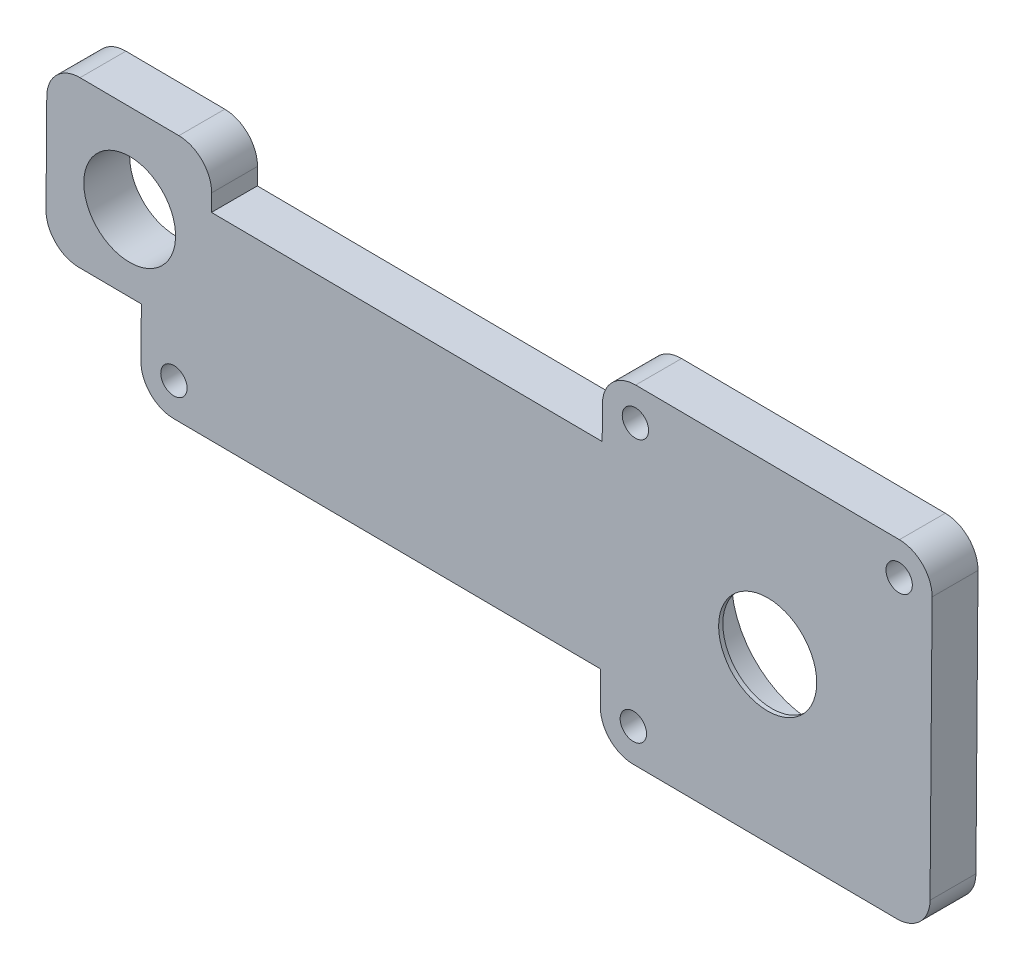
ISO-10303-21;
HEADER;
FILE_DESCRIPTION(('STEP AP214'),'2;1');
FILE_NAME('part.step','',(''),(''),'','','');
FILE_SCHEMA(('AUTOMOTIVE_DESIGN { 1 0 10303 214 1 1 1 1 }'));
ENDSEC;
DATA;
#1=APPLICATION_CONTEXT('core data for automotive mechanical design processes');
#2=APPLICATION_PROTOCOL_DEFINITION('international standard','automotive_design',2000,#1);
#3=PRODUCT_CONTEXT('',#1,'mechanical');
#4=PRODUCT('Part','Part','',(#3));
#5=PRODUCT_RELATED_PRODUCT_CATEGORY('part','',(#4));
#6=PRODUCT_DEFINITION_FORMATION('','',#4);
#7=PRODUCT_DEFINITION_CONTEXT('part definition',#1,'design');
#8=PRODUCT_DEFINITION('design','',#6,#7);
#9=PRODUCT_DEFINITION_SHAPE('','',#8);
#10=(LENGTH_UNIT() NAMED_UNIT(*) SI_UNIT(.MILLI.,.METRE.));
#11=(NAMED_UNIT(*) PLANE_ANGLE_UNIT() SI_UNIT($,.RADIAN.));
#12=(NAMED_UNIT(*) SI_UNIT($,.STERADIAN.) SOLID_ANGLE_UNIT());
#13=UNCERTAINTY_MEASURE_WITH_UNIT(LENGTH_MEASURE(1.E-05),#10,'distance_accuracy_value','');
#14=(GEOMETRIC_REPRESENTATION_CONTEXT(3) GLOBAL_UNCERTAINTY_ASSIGNED_CONTEXT((#13)) GLOBAL_UNIT_ASSIGNED_CONTEXT((#10,
#11,#12)) REPRESENTATION_CONTEXT('',''));
#15=CARTESIAN_POINT('',(0.,0.,0.));
#16=DIRECTION('',(0.,0.,1.));
#17=DIRECTION('',(1.,0.,0.));
#18=AXIS2_PLACEMENT_3D('',#15,#16,#17);
#19=CARTESIAN_POINT('',(33.387081626011,0.456569755791503,4.4196));
#20=DIRECTION('',(0.,0.,-1.));
#21=DIRECTION('',(-1.,0.,0.));
#22=AXIS2_PLACEMENT_3D('',#19,#20,#21);
#23=CYLINDRICAL_SURFACE('',#22,4.7244);
#24=CARTESIAN_POINT('',(33.387081626011,0.456569755791503,4.4196));
#25=DIRECTION('',(0.,0.,1.));
#26=DIRECTION('',(1.,0.,0.));
#27=AXIS2_PLACEMENT_3D('',#24,#25,#26);
#28=CIRCLE('',#27,4.7244);
#29=CARTESIAN_POINT('',(38.111481626011,0.456569755791503,4.4196));
#30=VERTEX_POINT('',#29);
#31=EDGE_CURVE('E210',#30,#30,#28,.T.);
#32=ORIENTED_EDGE('',*,*,#31,.T.);
#33=EDGE_LOOP('',(#32));
#34=FACE_BOUND('',#33,.T.);
#35=CARTESIAN_POINT('',(33.387081626011,0.456569755791503,4.0132));
#36=DIRECTION('',(0.,0.,-1.));
#37=DIRECTION('',(-1.,0.,0.));
#38=AXIS2_PLACEMENT_3D('',#35,#36,#37);
#39=CIRCLE('',#38,4.7244);
#40=CARTESIAN_POINT('',(28.662681626011,0.456569755791503,4.0132));
#41=VERTEX_POINT('',#40);
#42=EDGE_CURVE('E39',#41,#41,#39,.T.);
#43=ORIENTED_EDGE('',*,*,#42,.T.);
#44=EDGE_LOOP('',(#43));
#45=FACE_BOUND('',#44,.T.);
#46=ADVANCED_FACE('F35',(#34,#45),#23,.F.);
#47=CARTESIAN_POINT('',(20.4512958171625,-12.0057845236984,4.4196));
#48=DIRECTION('',(0.,0.,1.));
#49=DIRECTION('',(1.,0.,0.));
#50=AXIS2_PLACEMENT_3D('',#47,#48,#49);
#51=PLANE('',#50);
#52=CARTESIAN_POINT('',(-23.7950447085191,-5.30793293938964,4.4196));
#53=DIRECTION('',(0.,0.,-1.));
#54=DIRECTION('',(-1.,0.,0.));
#55=AXIS2_PLACEMENT_3D('',#52,#53,#54);
#56=CIRCLE('',#55,1.27);
#57=CARTESIAN_POINT('',(-25.0650447085191,-5.30793293938964,4.4196));
#58=VERTEX_POINT('',#57);
#59=EDGE_CURVE('E488',#58,#58,#56,.T.);
#60=ORIENTED_EDGE('',*,*,#59,.T.);
#61=EDGE_LOOP('',(#60));
#62=FACE_BOUND('',#61,.T.);
#63=CARTESIAN_POINT('',(20.4512958171625,-12.0057845236984,4.4196));
#64=DIRECTION('',(0.,0.,-1.));
#65=DIRECTION('',(-1.,0.,0.));
#66=AXIS2_PLACEMENT_3D('',#63,#64,#65);
#67=CIRCLE('',#66,1.27);
#68=CARTESIAN_POINT('',(19.1812958171625,-12.0057845236984,4.4196));
#69=VERTEX_POINT('',#68);
#70=EDGE_CURVE('E492',#69,#69,#67,.T.);
#71=ORIENTED_EDGE('',*,*,#70,.T.);
#72=EDGE_LOOP('',(#71));
#73=FACE_BOUND('',#72,.T.);
#74=CARTESIAN_POINT('',(20.6508643890522,13.3934314560344,4.4196));
#75=DIRECTION('',(0.,0.,-1.));
#76=DIRECTION('',(-1.,0.,0.));
#77=AXIS2_PLACEMENT_3D('',#74,#75,#76);
#78=CIRCLE('',#77,1.27);
#79=CARTESIAN_POINT('',(19.3808643890522,13.3934314560344,4.4196));
#80=VERTEX_POINT('',#79);
#81=EDGE_CURVE('E496',#80,#80,#78,.T.);
#82=ORIENTED_EDGE('',*,*,#81,.T.);
#83=EDGE_LOOP('',(#82));
#84=FACE_BOUND('',#83,.T.);
#85=CARTESIAN_POINT('',(46.0500803687849,13.1938628841448,4.4196));
#86=DIRECTION('',(0.,0.,-1.));
#87=DIRECTION('',(-1.,0.,0.));
#88=AXIS2_PLACEMENT_3D('',#85,#86,#87);
#89=CIRCLE('',#88,1.27);
#90=CARTESIAN_POINT('',(44.7800803687849,13.1938628841448,4.4196));
#91=VERTEX_POINT('',#90);
#92=EDGE_CURVE('E500',#91,#91,#89,.T.);
#93=ORIENTED_EDGE('',*,*,#92,.T.);
#94=EDGE_LOOP('',(#93));
#95=FACE_BOUND('',#94,.T.);
#96=CARTESIAN_POINT('',(-28.0559815167822,6.85189940269737,4.4196));
#97=DIRECTION('',(0.,0.,-1.));
#98=DIRECTION('',(-1.,0.,0.));
#99=AXIS2_PLACEMENT_3D('',#96,#97,#98);
#100=CIRCLE('',#99,4.4196);
#101=CARTESIAN_POINT('',(-32.4755815167822,6.85189940269737,4.4196));
#102=VERTEX_POINT('',#101);
#103=EDGE_CURVE('E504',#102,#102,#100,.T.);
#104=ORIENTED_EDGE('',*,*,#103,.T.);
#105=EDGE_LOOP('',(#104));
#106=FACE_BOUND('',#105,.T.);
#107=DIRECTION('',(0.999969133060346,-0.00785703038935576,0.));
#108=VECTOR('',#107,1.);
#109=CARTESIAN_POINT('',(-23.8199907800052,-8.48283493685624,4.4196));
#110=LINE('',#109,#108);
#111=CARTESIAN_POINT('',(-23.8199907800052,-8.48283493685624,4.4196));
#112=VERTEX_POINT('',#111);
#113=CARTESIAN_POINT('',(17.3013398911821,-8.80593645474556,4.4196));
#114=VERTEX_POINT('',#113);
#115=EDGE_CURVE('E245',#112,#114,#110,.T.);
#116=ORIENTED_EDGE('',*,*,#115,.T.);
#117=DIRECTION('',(-0.00785703038935553,-0.999969133060346,0.));
#118=VECTOR('',#117,1.);
#119=CARTESIAN_POINT('',(17.3013398911821,-8.80593645474556,4.4196));
#120=LINE('',#119,#118);
#121=CARTESIAN_POINT('',(17.2763938196959,-11.9808384522122,4.4196));
#122=VERTEX_POINT('',#121);
#123=EDGE_CURVE('E132',#114,#122,#120,.T.);
#124=ORIENTED_EDGE('',*,*,#123,.T.);
#125=CARTESIAN_POINT('',(20.4512958171625,-12.0057845236984,4.4196));
#126=DIRECTION('',(0.,0.,1.));
#127=DIRECTION('',(1.,0.,0.));
#128=AXIS2_PLACEMENT_3D('',#125,#126,#127);
#129=CIRCLE('',#128,3.175);
#130=CARTESIAN_POINT('',(20.4263497456763,-15.180686521165,4.4196));
#131=VERTEX_POINT('',#130);
#132=EDGE_CURVE('E297',#122,#131,#129,.T.);
#133=ORIENTED_EDGE('',*,*,#132,.T.);
#134=DIRECTION('',(0.999969133060346,-0.00785703038935567,0.));
#135=VECTOR('',#134,1.);
#136=CARTESIAN_POINT('',(20.4263497456763,-15.180686521165,4.4196));
#137=LINE('',#136,#135);
#138=CARTESIAN_POINT('',(45.8255657254091,-15.3802550930546,4.4196));
#139=VERTEX_POINT('',#138);
#140=EDGE_CURVE('E315',#131,#139,#137,.T.);
#141=ORIENTED_EDGE('',*,*,#140,.T.);
#142=CARTESIAN_POINT('',(45.8505117968953,-12.205353095588,4.4196));
#143=DIRECTION('',(0.,0.,1.));
#144=DIRECTION('',(1.,0.,0.));
#145=AXIS2_PLACEMENT_3D('',#142,#143,#144);
#146=CIRCLE('',#145,3.175);
#147=CARTESIAN_POINT('',(49.0254137943619,-12.2302991670742,4.4196));
#148=VERTEX_POINT('',#147);
#149=EDGE_CURVE('E312',#139,#148,#146,.T.);
#150=ORIENTED_EDGE('',*,*,#149,.T.);
#151=DIRECTION('',(0.00785703038935553,0.999969133060346,0.));
#152=VECTOR('',#151,1.);
#153=CARTESIAN_POINT('',(49.0254137943619,-12.2302991670742,4.4196));
#154=LINE('',#153,#152);
#155=CARTESIAN_POINT('',(49.2249823662515,13.1689168126586,4.4196));
#156=VERTEX_POINT('',#155);
#157=EDGE_CURVE('E314',#148,#156,#154,.T.);
#158=ORIENTED_EDGE('',*,*,#157,.T.);
#159=CARTESIAN_POINT('',(46.0500803687849,13.1938628841448,4.4196));
#160=DIRECTION('',(0.,0.,1.));
#161=DIRECTION('',(1.,0.,0.));
#162=AXIS2_PLACEMENT_3D('',#159,#160,#161);
#163=CIRCLE('',#162,3.17499999999999);
#164=CARTESIAN_POINT('',(46.0750264402711,16.3687648816114,4.4196));
#165=VERTEX_POINT('',#164);
#166=EDGE_CURVE('E317',#156,#165,#163,.T.);
#167=ORIENTED_EDGE('',*,*,#166,.T.);
#168=DIRECTION('',(-0.999969133060346,0.00785703038935594,0.));
#169=VECTOR('',#168,1.);
#170=CARTESIAN_POINT('',(46.0750264402711,16.3687648816114,4.4196));
#171=LINE('',#170,#169);
#172=CARTESIAN_POINT('',(20.6758104605384,16.568333453501,4.4196));
#173=VERTEX_POINT('',#172);
#174=EDGE_CURVE('E323',#165,#173,#171,.T.);
#175=ORIENTED_EDGE('',*,*,#174,.T.);
#176=CARTESIAN_POINT('',(20.6508643890522,13.3934314560344,4.4196));
#177=DIRECTION('',(0.,0.,1.));
#178=DIRECTION('',(1.,0.,0.));
#179=AXIS2_PLACEMENT_3D('',#176,#177,#178);
#180=CIRCLE('',#179,3.175);
#181=CARTESIAN_POINT('',(17.4759623915856,13.4183775275206,4.4196));
#182=VERTEX_POINT('',#181);
#183=EDGE_CURVE('E325',#173,#182,#180,.T.);
#184=ORIENTED_EDGE('',*,*,#183,.T.);
#185=DIRECTION('',(-0.0078570303893556,-0.999969133060347,0.));
#186=VECTOR('',#185,1.);
#187=CARTESIAN_POINT('',(17.4759623915856,13.4183775275206,4.4196));
#188=LINE('',#187,#186);
#189=CARTESIAN_POINT('',(17.4510163200994,10.243475530054,4.4196));
#190=VERTEX_POINT('',#189);
#191=EDGE_CURVE('E327',#182,#190,#188,.T.);
#192=ORIENTED_EDGE('',*,*,#191,.T.);
#193=DIRECTION('',(-0.999969133060346,0.00785703038935576,0.));
#194=VECTOR('',#193,1.);
#195=CARTESIAN_POINT('',(17.4510163200994,10.243475530054,4.4196));
#196=LINE('',#195,#194);
#197=CARTESIAN_POINT('',(-20.1783852823722,10.5391400082355,4.4196));
#198=VERTEX_POINT('',#197);
#199=EDGE_CURVE('E329',#190,#198,#196,.T.);
#200=ORIENTED_EDGE('',*,*,#199,.T.);
#201=DIRECTION('',(0.00785703038935568,0.999969133060346,0.));
#202=VECTOR('',#201,1.);
#203=CARTESIAN_POINT('',(-20.1783852823722,10.5391400082355,4.4196));
#204=LINE('',#203,#202);
#205=CARTESIAN_POINT('',(-20.1655560902158,12.1719192546872,4.4196));
#206=VERTEX_POINT('',#205);
#207=EDGE_CURVE('E331',#198,#206,#204,.T.);
#208=ORIENTED_EDGE('',*,*,#207,.T.);
#209=CARTESIAN_POINT('',(-23.3404580876824,12.1968653261734,4.4196));
#210=DIRECTION('',(0.,0.,1.));
#211=DIRECTION('',(1.,0.,0.));
#212=AXIS2_PLACEMENT_3D('',#209,#210,#211);
#213=CIRCLE('',#212,3.175);
#214=CARTESIAN_POINT('',(-23.3155120161963,15.37176732364,4.4196));
#215=VERTEX_POINT('',#214);
#216=EDGE_CURVE('E333',#206,#215,#213,.T.);
#217=ORIENTED_EDGE('',*,*,#216,.T.);
#218=DIRECTION('',(-0.999969133060346,0.00785703038935519,0.));
#219=VECTOR('',#218,1.);
#220=CARTESIAN_POINT('',(-23.3155120161963,15.37176732364,4.4196));
#221=LINE('',#220,#219);
#222=CARTESIAN_POINT('',(-32.840218008596,15.4466055380986,4.4196));
#223=VERTEX_POINT('',#222);
#224=EDGE_CURVE('E335',#215,#223,#221,.T.);
#225=ORIENTED_EDGE('',*,*,#224,.T.);
#226=CARTESIAN_POINT('',(-32.8651640800823,12.271703540632,4.4196));
#227=DIRECTION('',(0.,0.,1.));
#228=DIRECTION('',(1.,0.,0.));
#229=AXIS2_PLACEMENT_3D('',#226,#227,#228);
#230=CIRCLE('',#229,3.175);
#231=CARTESIAN_POINT('',(-36.0400660775488,12.2966496121182,4.4196));
#232=VERTEX_POINT('',#231);
#233=EDGE_CURVE('E337',#223,#232,#230,.T.);
#234=ORIENTED_EDGE('',*,*,#233,.T.);
#235=DIRECTION('',(-0.00785703038935555,-0.999969133060346,0.));
#236=VECTOR('',#235,1.);
#237=CARTESIAN_POINT('',(-36.0400660775488,12.2966496121182,4.4196));
#238=LINE('',#237,#236);
#239=CARTESIAN_POINT('',(-36.1149042920075,2.77194361971845,4.4196));
#240=VERTEX_POINT('',#239);
#241=EDGE_CURVE('E339',#232,#240,#238,.T.);
#242=ORIENTED_EDGE('',*,*,#241,.T.);
#243=CARTESIAN_POINT('',(-32.9400022945409,2.74699754823223,4.4196));
#244=DIRECTION('',(0.,0.,1.));
#245=DIRECTION('',(1.,0.,0.));
#246=AXIS2_PLACEMENT_3D('',#243,#244,#245);
#247=CIRCLE('',#246,3.175);
#248=CARTESIAN_POINT('',(-32.964948366027,-0.427904449234371,4.4196));
#249=VERTEX_POINT('',#248);
#250=EDGE_CURVE('E188',#240,#249,#247,.T.);
#251=ORIENTED_EDGE('',*,*,#250,.T.);
#252=DIRECTION('',(0.999969133060346,-0.00785703038935611,0.));
#253=VECTOR('',#252,1.);
#254=CARTESIAN_POINT('',(-32.964948366027,-0.427904449234371,4.4196));
#255=LINE('',#254,#253);
#256=CARTESIAN_POINT('',(-26.9321714423431,-0.475305623985163,4.4196));
#257=VERTEX_POINT('',#256);
#258=EDGE_CURVE('E181',#249,#257,#255,.T.);
#259=ORIENTED_EDGE('',*,*,#258,.T.);
#260=DIRECTION('',(-0.00785703038935558,-0.999969133060346,0.));
#261=VECTOR('',#260,1.);
#262=CARTESIAN_POINT('',(-26.9321714423431,-0.475305623985163,4.4196));
#263=LINE('',#262,#261);
#264=CARTESIAN_POINT('',(-26.9699467059857,-5.28298686790341,4.4196));
#265=VERTEX_POINT('',#264);
#266=EDGE_CURVE('E186',#257,#265,#263,.T.);
#267=ORIENTED_EDGE('',*,*,#266,.T.);
#268=CARTESIAN_POINT('',(-23.7950447085191,-5.30793293938964,4.4196));
#269=DIRECTION('',(0.,0.,1.));
#270=DIRECTION('',(1.,0.,0.));
#271=AXIS2_PLACEMENT_3D('',#268,#269,#270);
#272=CIRCLE('',#271,3.175);
#273=EDGE_CURVE('E53',#265,#112,#272,.T.);
#274=ORIENTED_EDGE('',*,*,#273,.T.);
#275=EDGE_LOOP('',(#116,#124,#133,#141,#150,#158,#167,#175,#184,#192,#200,#208,#217,#225,#234,
#242,#251,#259,#267,#274));
#276=FACE_BOUND('',#275,.T.);
#277=ORIENTED_EDGE('',*,*,#31,.F.);
#278=EDGE_LOOP('',(#277));
#279=FACE_BOUND('',#278,.T.);
#280=ADVANCED_FACE('F183',(#62,#73,#84,#95,#106,#276,#279),#51,.T.);
#281=CARTESIAN_POINT('',(20.4512958171625,-12.0057845236984,0.));
#282=DIRECTION('',(0.,0.,1.));
#283=DIRECTION('',(1.,0.,0.));
#284=AXIS2_PLACEMENT_3D('',#281,#282,#283);
#285=PLANE('',#284);
#286=CARTESIAN_POINT('',(-23.7950447085191,-5.30793293938964,0.));
#287=DIRECTION('',(0.,0.,-1.));
#288=DIRECTION('',(-1.,0.,0.));
#289=AXIS2_PLACEMENT_3D('',#286,#287,#288);
#290=CIRCLE('',#289,1.27);
#291=CARTESIAN_POINT('',(-25.0650447085191,-5.30793293938964,0.));
#292=VERTEX_POINT('',#291);
#293=EDGE_CURVE('E386',#292,#292,#290,.T.);
#294=ORIENTED_EDGE('',*,*,#293,.F.);
#295=EDGE_LOOP('',(#294));
#296=FACE_BOUND('',#295,.T.);
#297=CARTESIAN_POINT('',(20.4512958171625,-12.0057845236984,0.));
#298=DIRECTION('',(0.,0.,-1.));
#299=DIRECTION('',(-1.,0.,0.));
#300=AXIS2_PLACEMENT_3D('',#297,#298,#299);
#301=CIRCLE('',#300,1.27);
#302=CARTESIAN_POINT('',(19.1812958171625,-12.0057845236984,0.));
#303=VERTEX_POINT('',#302);
#304=EDGE_CURVE('E390',#303,#303,#301,.T.);
#305=ORIENTED_EDGE('',*,*,#304,.F.);
#306=EDGE_LOOP('',(#305));
#307=FACE_BOUND('',#306,.T.);
#308=CARTESIAN_POINT('',(20.6508643890522,13.3934314560344,0.));
#309=DIRECTION('',(0.,0.,-1.));
#310=DIRECTION('',(-1.,0.,0.));
#311=AXIS2_PLACEMENT_3D('',#308,#309,#310);
#312=CIRCLE('',#311,1.27);
#313=CARTESIAN_POINT('',(19.3808643890522,13.3934314560344,0.));
#314=VERTEX_POINT('',#313);
#315=EDGE_CURVE('E394',#314,#314,#312,.T.);
#316=ORIENTED_EDGE('',*,*,#315,.F.);
#317=EDGE_LOOP('',(#316));
#318=FACE_BOUND('',#317,.T.);
#319=CARTESIAN_POINT('',(46.0500803687849,13.1938628841448,0.));
#320=DIRECTION('',(0.,0.,-1.));
#321=DIRECTION('',(-1.,0.,0.));
#322=AXIS2_PLACEMENT_3D('',#319,#320,#321);
#323=CIRCLE('',#322,1.27);
#324=CARTESIAN_POINT('',(44.7800803687849,13.1938628841448,0.));
#325=VERTEX_POINT('',#324);
#326=EDGE_CURVE('E398',#325,#325,#323,.T.);
#327=ORIENTED_EDGE('',*,*,#326,.F.);
#328=EDGE_LOOP('',(#327));
#329=FACE_BOUND('',#328,.T.);
#330=CARTESIAN_POINT('',(-28.0559815167822,6.85189940269737,0.));
#331=DIRECTION('',(0.,0.,-1.));
#332=DIRECTION('',(-1.,0.,0.));
#333=AXIS2_PLACEMENT_3D('',#330,#331,#332);
#334=CIRCLE('',#333,4.4196);
#335=CARTESIAN_POINT('',(-32.4755815167822,6.85189940269737,0.));
#336=VERTEX_POINT('',#335);
#337=EDGE_CURVE('E402',#336,#336,#334,.T.);
#338=ORIENTED_EDGE('',*,*,#337,.F.);
#339=EDGE_LOOP('',(#338));
#340=FACE_BOUND('',#339,.T.);
#341=CARTESIAN_POINT('',(-17.260518373989,0.456569755791554,0.));
#342=DIRECTION('',(0.,0.,-1.));
#343=DIRECTION('',(-1.,0.,0.));
#344=AXIS2_PLACEMENT_3D('',#341,#342,#343);
#345=CIRCLE('',#344,2.2987);
#346=CARTESIAN_POINT('',(-19.559218373989,0.456569755791554,0.));
#347=VERTEX_POINT('',#346);
#348=EDGE_CURVE('E406',#347,#347,#345,.T.);
#349=ORIENTED_EDGE('',*,*,#348,.F.);
#350=EDGE_LOOP('',(#349));
#351=FACE_BOUND('',#350,.T.);
#352=CARTESIAN_POINT('',(-2.47771837398898,0.456569755791517,0.));
#353=DIRECTION('',(0.,0.,-1.));
#354=DIRECTION('',(-1.,0.,0.));
#355=AXIS2_PLACEMENT_3D('',#352,#353,#354);
#356=CIRCLE('',#355,2.2987);
#357=CARTESIAN_POINT('',(-4.77641837398898,0.456569755791517,0.));
#358=VERTEX_POINT('',#357);
#359=EDGE_CURVE('E410',#358,#358,#356,.T.);
#360=ORIENTED_EDGE('',*,*,#359,.F.);
#361=EDGE_LOOP('',(#360));
#362=FACE_BOUND('',#361,.T.);
#363=CARTESIAN_POINT('',(12.305081626011,0.456569755791517,0.));
#364=DIRECTION('',(0.,0.,-1.));
#365=DIRECTION('',(-1.,0.,0.));
#366=AXIS2_PLACEMENT_3D('',#363,#364,#365);
#367=CIRCLE('',#366,2.2987);
#368=CARTESIAN_POINT('',(10.006381626011,0.456569755791517,0.));
#369=VERTEX_POINT('',#368);
#370=EDGE_CURVE('E414',#369,#369,#367,.T.);
#371=ORIENTED_EDGE('',*,*,#370,.F.);
#372=EDGE_LOOP('',(#371));
#373=FACE_BOUND('',#372,.T.);
#374=CARTESIAN_POINT('',(33.387081626011,0.456569755791503,0.));
#375=DIRECTION('',(0.,0.,-1.));
#376=DIRECTION('',(-1.,0.,0.));
#377=AXIS2_PLACEMENT_3D('',#374,#375,#376);
#378=CIRCLE('',#377,7.8994);
#379=CARTESIAN_POINT('',(25.487681626011,0.456569755791503,0.));
#380=VERTEX_POINT('',#379);
#381=EDGE_CURVE('E417',#380,#380,#378,.T.);
#382=ORIENTED_EDGE('',*,*,#381,.F.);
#383=EDGE_LOOP('',(#382));
#384=FACE_BOUND('',#383,.T.);
#385=DIRECTION('',(0.999969133060346,-0.00785703038935576,0.));
#386=VECTOR('',#385,1.);
#387=CARTESIAN_POINT('',(-23.8199907800052,-8.48283493685624,0.));
#388=LINE('',#387,#386);
#389=CARTESIAN_POINT('',(-23.8199907800052,-8.48283493685624,0.));
#390=VERTEX_POINT('',#389);
#391=CARTESIAN_POINT('',(17.3013398911821,-8.80593645474556,0.));
#392=VERTEX_POINT('',#391);
#393=EDGE_CURVE('E206',#390,#392,#388,.T.);
#394=ORIENTED_EDGE('',*,*,#393,.F.);
#395=CARTESIAN_POINT('',(-23.7950447085191,-5.30793293938964,0.));
#396=DIRECTION('',(0.,0.,1.));
#397=DIRECTION('',(1.,0.,0.));
#398=AXIS2_PLACEMENT_3D('',#395,#396,#397);
#399=CIRCLE('',#398,3.175);
#400=CARTESIAN_POINT('',(-26.9699467059857,-5.28298686790341,0.));
#401=VERTEX_POINT('',#400);
#402=EDGE_CURVE('E124',#401,#390,#399,.T.);
#403=ORIENTED_EDGE('',*,*,#402,.F.);
#404=DIRECTION('',(-0.00785703038935558,-0.999969133060346,0.));
#405=VECTOR('',#404,1.);
#406=CARTESIAN_POINT('',(-26.9321714423431,-0.475305623985163,0.));
#407=LINE('',#406,#405);
#408=CARTESIAN_POINT('',(-26.9321714423431,-0.475305623985163,0.));
#409=VERTEX_POINT('',#408);
#410=EDGE_CURVE('E118',#409,#401,#407,.T.);
#411=ORIENTED_EDGE('',*,*,#410,.F.);
#412=DIRECTION('',(0.999969133060346,-0.00785703038935611,0.));
#413=VECTOR('',#412,1.);
#414=CARTESIAN_POINT('',(-32.964948366027,-0.427904449234371,0.));
#415=LINE('',#414,#413);
#416=CARTESIAN_POINT('',(-32.964948366027,-0.427904449234371,0.));
#417=VERTEX_POINT('',#416);
#418=EDGE_CURVE('E196',#417,#409,#415,.T.);
#419=ORIENTED_EDGE('',*,*,#418,.F.);
#420=CARTESIAN_POINT('',(-32.9400022945409,2.74699754823223,0.));
#421=DIRECTION('',(0.,0.,1.));
#422=DIRECTION('',(1.,0.,0.));
#423=AXIS2_PLACEMENT_3D('',#420,#421,#422);
#424=CIRCLE('',#423,3.175);
#425=CARTESIAN_POINT('',(-36.1149042920075,2.77194361971845,0.));
#426=VERTEX_POINT('',#425);
#427=EDGE_CURVE('E240',#426,#417,#424,.T.);
#428=ORIENTED_EDGE('',*,*,#427,.F.);
#429=DIRECTION('',(-0.00785703038935555,-0.999969133060346,0.));
#430=VECTOR('',#429,1.);
#431=CARTESIAN_POINT('',(-36.0400660775488,12.2966496121182,0.));
#432=LINE('',#431,#430);
#433=CARTESIAN_POINT('',(-36.0400660775488,12.2966496121182,0.));
#434=VERTEX_POINT('',#433);
#435=EDGE_CURVE('E238',#434,#426,#432,.T.);
#436=ORIENTED_EDGE('',*,*,#435,.F.);
#437=CARTESIAN_POINT('',(-32.8651640800823,12.271703540632,0.));
#438=DIRECTION('',(0.,0.,1.));
#439=DIRECTION('',(1.,0.,0.));
#440=AXIS2_PLACEMENT_3D('',#437,#438,#439);
#441=CIRCLE('',#440,3.175);
#442=CARTESIAN_POINT('',(-32.840218008596,15.4466055380986,0.));
#443=VERTEX_POINT('',#442);
#444=EDGE_CURVE('E236',#443,#434,#441,.T.);
#445=ORIENTED_EDGE('',*,*,#444,.F.);
#446=DIRECTION('',(-0.999969133060346,0.00785703038935519,0.));
#447=VECTOR('',#446,1.);
#448=CARTESIAN_POINT('',(-23.3155120161963,15.37176732364,0.));
#449=LINE('',#448,#447);
#450=CARTESIAN_POINT('',(-23.3155120161963,15.37176732364,0.));
#451=VERTEX_POINT('',#450);
#452=EDGE_CURVE('E234',#451,#443,#449,.T.);
#453=ORIENTED_EDGE('',*,*,#452,.F.);
#454=CARTESIAN_POINT('',(-23.3404580876824,12.1968653261734,0.));
#455=DIRECTION('',(0.,0.,1.));
#456=DIRECTION('',(1.,0.,0.));
#457=AXIS2_PLACEMENT_3D('',#454,#455,#456);
#458=CIRCLE('',#457,3.175);
#459=CARTESIAN_POINT('',(-20.1655560902158,12.1719192546872,0.));
#460=VERTEX_POINT('',#459);
#461=EDGE_CURVE('E232',#460,#451,#458,.T.);
#462=ORIENTED_EDGE('',*,*,#461,.F.);
#463=DIRECTION('',(0.00785703038935568,0.999969133060346,0.));
#464=VECTOR('',#463,1.);
#465=CARTESIAN_POINT('',(-20.1783852823722,10.5391400082355,0.));
#466=LINE('',#465,#464);
#467=CARTESIAN_POINT('',(-20.1783852823722,10.5391400082355,0.));
#468=VERTEX_POINT('',#467);
#469=EDGE_CURVE('E230',#468,#460,#466,.T.);
#470=ORIENTED_EDGE('',*,*,#469,.F.);
#471=DIRECTION('',(-0.999969133060346,0.00785703038935576,0.));
#472=VECTOR('',#471,1.);
#473=CARTESIAN_POINT('',(17.4510163200994,10.243475530054,0.));
#474=LINE('',#473,#472);
#475=CARTESIAN_POINT('',(17.4510163200994,10.243475530054,0.));
#476=VERTEX_POINT('',#475);
#477=EDGE_CURVE('E228',#476,#468,#474,.T.);
#478=ORIENTED_EDGE('',*,*,#477,.F.);
#479=DIRECTION('',(-0.0078570303893556,-0.999969133060347,0.));
#480=VECTOR('',#479,1.);
#481=CARTESIAN_POINT('',(17.4759623915856,13.4183775275206,0.));
#482=LINE('',#481,#480);
#483=CARTESIAN_POINT('',(17.4759623915856,13.4183775275206,0.));
#484=VERTEX_POINT('',#483);
#485=EDGE_CURVE('E226',#484,#476,#482,.T.);
#486=ORIENTED_EDGE('',*,*,#485,.F.);
#487=CARTESIAN_POINT('',(20.6508643890522,13.3934314560344,0.));
#488=DIRECTION('',(0.,0.,1.));
#489=DIRECTION('',(1.,0.,0.));
#490=AXIS2_PLACEMENT_3D('',#487,#488,#489);
#491=CIRCLE('',#490,3.175);
#492=CARTESIAN_POINT('',(20.6758104605384,16.568333453501,0.));
#493=VERTEX_POINT('',#492);
#494=EDGE_CURVE('E224',#493,#484,#491,.T.);
#495=ORIENTED_EDGE('',*,*,#494,.F.);
#496=DIRECTION('',(-0.999969133060346,0.00785703038935594,0.));
#497=VECTOR('',#496,1.);
#498=CARTESIAN_POINT('',(46.0750264402711,16.3687648816114,0.));
#499=LINE('',#498,#497);
#500=CARTESIAN_POINT('',(46.0750264402711,16.3687648816114,0.));
#501=VERTEX_POINT('',#500);
#502=EDGE_CURVE('E222',#501,#493,#499,.T.);
#503=ORIENTED_EDGE('',*,*,#502,.F.);
#504=CARTESIAN_POINT('',(46.0500803687849,13.1938628841448,0.));
#505=DIRECTION('',(0.,0.,1.));
#506=DIRECTION('',(1.,0.,0.));
#507=AXIS2_PLACEMENT_3D('',#504,#505,#506);
#508=CIRCLE('',#507,3.17499999999999);
#509=CARTESIAN_POINT('',(49.2249823662515,13.1689168126586,0.));
#510=VERTEX_POINT('',#509);
#511=EDGE_CURVE('E220',#510,#501,#508,.T.);
#512=ORIENTED_EDGE('',*,*,#511,.F.);
#513=DIRECTION('',(0.00785703038935553,0.999969133060346,0.));
#514=VECTOR('',#513,1.);
#515=CARTESIAN_POINT('',(49.0254137943619,-12.2302991670742,0.));
#516=LINE('',#515,#514);
#517=CARTESIAN_POINT('',(49.0254137943619,-12.2302991670742,0.));
#518=VERTEX_POINT('',#517);
#519=EDGE_CURVE('E218',#518,#510,#516,.T.);
#520=ORIENTED_EDGE('',*,*,#519,.F.);
#521=CARTESIAN_POINT('',(45.8505117968953,-12.205353095588,0.));
#522=DIRECTION('',(0.,0.,1.));
#523=DIRECTION('',(1.,0.,0.));
#524=AXIS2_PLACEMENT_3D('',#521,#522,#523);
#525=CIRCLE('',#524,3.175);
#526=CARTESIAN_POINT('',(45.8255657254091,-15.3802550930546,0.));
#527=VERTEX_POINT('',#526);
#528=EDGE_CURVE('E216',#527,#518,#525,.T.);
#529=ORIENTED_EDGE('',*,*,#528,.F.);
#530=DIRECTION('',(0.999969133060346,-0.00785703038935567,0.));
#531=VECTOR('',#530,1.);
#532=CARTESIAN_POINT('',(20.4263497456763,-15.180686521165,0.));
#533=LINE('',#532,#531);
#534=CARTESIAN_POINT('',(20.4263497456763,-15.180686521165,0.));
#535=VERTEX_POINT('',#534);
#536=EDGE_CURVE('E214',#535,#527,#533,.T.);
#537=ORIENTED_EDGE('',*,*,#536,.F.);
#538=CARTESIAN_POINT('',(20.4512958171625,-12.0057845236984,0.));
#539=DIRECTION('',(0.,0.,1.));
#540=DIRECTION('',(1.,0.,0.));
#541=AXIS2_PLACEMENT_3D('',#538,#539,#540);
#542=CIRCLE('',#541,3.175);
#543=CARTESIAN_POINT('',(17.2763938196959,-11.9808384522122,0.));
#544=VERTEX_POINT('',#543);
#545=EDGE_CURVE('E212',#544,#535,#542,.T.);
#546=ORIENTED_EDGE('',*,*,#545,.F.);
#547=DIRECTION('',(-0.00785703038935553,-0.999969133060346,0.));
#548=VECTOR('',#547,1.);
#549=CARTESIAN_POINT('',(17.3013398911821,-8.80593645474556,0.));
#550=LINE('',#549,#548);
#551=EDGE_CURVE('E209',#392,#544,#550,.T.);
#552=ORIENTED_EDGE('',*,*,#551,.F.);
#553=EDGE_LOOP('',(#394,#403,#411,#419,#428,#436,#445,#453,#462,#470,#478,#486,#495,#503,#512,
#520,#529,#537,#546,#552));
#554=FACE_BOUND('',#553,.T.);
#555=ADVANCED_FACE('F301',(#296,#307,#318,#329,#340,#351,#362,#373,#384,#554),#285,.F.);
#556=CARTESIAN_POINT('',(-23.8199907800052,-8.48283493685624,4.4196));
#557=DIRECTION('',(0.00785703038935576,0.999969133060346,0.));
#558=DIRECTION('',(-0.999969133060346,0.00785703038935576,0.));
#559=AXIS2_PLACEMENT_3D('',#556,#557,#558);
#560=PLANE('',#559);
#561=ORIENTED_EDGE('',*,*,#393,.T.);
#562=DIRECTION('',(0.,0.,-1.));
#563=VECTOR('',#562,1.);
#564=CARTESIAN_POINT('',(17.3013398911821,-8.80593645474556,4.4196));
#565=LINE('',#564,#563);
#566=EDGE_CURVE('E11',#114,#392,#565,.T.);
#567=ORIENTED_EDGE('',*,*,#566,.F.);
#568=ORIENTED_EDGE('',*,*,#115,.F.);
#569=DIRECTION('',(0.,0.,-1.));
#570=VECTOR('',#569,1.);
#571=CARTESIAN_POINT('',(-23.8199907800052,-8.48283493685624,4.4196));
#572=LINE('',#571,#570);
#573=EDGE_CURVE('E202',#112,#390,#572,.T.);
#574=ORIENTED_EDGE('',*,*,#573,.T.);
#575=EDGE_LOOP('',(#561,#567,#568,#574));
#576=FACE_BOUND('',#575,.T.);
#577=ADVANCED_FACE('F37',(#576),#560,.F.);
#578=CARTESIAN_POINT('',(17.3013398911821,-8.80593645474556,4.4196));
#579=DIRECTION('',(0.999969133060346,-0.00785703038935554,0.));
#580=DIRECTION('',(0.00785703038935554,0.999969133060346,0.));
#581=AXIS2_PLACEMENT_3D('',#578,#579,#580);
#582=PLANE('',#581);
#583=ORIENTED_EDGE('',*,*,#551,.T.);
#584=DIRECTION('',(0.,0.,-1.));
#585=VECTOR('',#584,1.);
#586=CARTESIAN_POINT('',(17.2763938196959,-11.9808384522122,4.4196));
#587=LINE('',#586,#585);
#588=EDGE_CURVE('E45',#122,#544,#587,.T.);
#589=ORIENTED_EDGE('',*,*,#588,.F.);
#590=ORIENTED_EDGE('',*,*,#123,.F.);
#591=ORIENTED_EDGE('',*,*,#566,.T.);
#592=EDGE_LOOP('',(#583,#589,#590,#591));
#593=FACE_BOUND('',#592,.T.);
#594=ADVANCED_FACE('F382',(#593),#582,.F.);
#595=CARTESIAN_POINT('',(20.4512958171625,-12.0057845236984,4.4196));
#596=DIRECTION('',(0.,0.,-1.));
#597=DIRECTION('',(-1.,0.,0.));
#598=AXIS2_PLACEMENT_3D('',#595,#596,#597);
#599=CYLINDRICAL_SURFACE('',#598,3.175);
#600=ORIENTED_EDGE('',*,*,#545,.T.);
#601=DIRECTION('',(0.,0.,-1.));
#602=VECTOR('',#601,1.);
#603=CARTESIAN_POINT('',(20.4263497456763,-15.180686521165,4.4196));
#604=LINE('',#603,#602);
#605=EDGE_CURVE('E288',#131,#535,#604,.T.);
#606=ORIENTED_EDGE('',*,*,#605,.F.);
#607=ORIENTED_EDGE('',*,*,#132,.F.);
#608=ORIENTED_EDGE('',*,*,#588,.T.);
#609=EDGE_LOOP('',(#600,#606,#607,#608));
#610=FACE_BOUND('',#609,.T.);
#611=ADVANCED_FACE('F295',(#610),#599,.T.);
#612=CARTESIAN_POINT('',(20.4263497456763,-15.180686521165,4.4196));
#613=DIRECTION('',(0.00785703038935567,0.999969133060346,0.));
#614=DIRECTION('',(-0.999969133060346,0.00785703038935567,0.));
#615=AXIS2_PLACEMENT_3D('',#612,#613,#614);
#616=PLANE('',#615);
#617=ORIENTED_EDGE('',*,*,#536,.T.);
#618=DIRECTION('',(0.,0.,-1.));
#619=VECTOR('',#618,1.);
#620=CARTESIAN_POINT('',(45.8255657254091,-15.3802550930546,4.4196));
#621=LINE('',#620,#619);
#622=EDGE_CURVE('E285',#139,#527,#621,.T.);
#623=ORIENTED_EDGE('',*,*,#622,.F.);
#624=ORIENTED_EDGE('',*,*,#140,.F.);
#625=ORIENTED_EDGE('',*,*,#605,.T.);
#626=EDGE_LOOP('',(#617,#623,#624,#625));
#627=FACE_BOUND('',#626,.T.);
#628=ADVANCED_FACE('F306',(#627),#616,.F.);
#629=CARTESIAN_POINT('',(45.8505117968953,-12.205353095588,4.4196));
#630=DIRECTION('',(0.,0.,-1.));
#631=DIRECTION('',(-1.,0.,0.));
#632=AXIS2_PLACEMENT_3D('',#629,#630,#631);
#633=CYLINDRICAL_SURFACE('',#632,3.175);
#634=ORIENTED_EDGE('',*,*,#528,.T.);
#635=DIRECTION('',(0.,0.,-1.));
#636=VECTOR('',#635,1.);
#637=CARTESIAN_POINT('',(49.0254137943619,-12.2302991670742,4.4196));
#638=LINE('',#637,#636);
#639=EDGE_CURVE('E282',#148,#518,#638,.T.);
#640=ORIENTED_EDGE('',*,*,#639,.F.);
#641=ORIENTED_EDGE('',*,*,#149,.F.);
#642=ORIENTED_EDGE('',*,*,#622,.T.);
#643=EDGE_LOOP('',(#634,#640,#641,#642));
#644=FACE_BOUND('',#643,.T.);
#645=ADVANCED_FACE('F310',(#644),#633,.T.);
#646=CARTESIAN_POINT('',(49.0254137943619,-12.2302991670742,4.4196));
#647=DIRECTION('',(-0.999969133060346,0.00785703038935553,0.));
#648=DIRECTION('',(-0.00785703038935553,-0.999969133060346,0.));
#649=AXIS2_PLACEMENT_3D('',#646,#647,#648);
#650=PLANE('',#649);
#651=ORIENTED_EDGE('',*,*,#519,.T.);
#652=DIRECTION('',(0.,0.,-1.));
#653=VECTOR('',#652,1.);
#654=CARTESIAN_POINT('',(49.2249823662515,13.1689168126586,4.4196));
#655=LINE('',#654,#653);
#656=EDGE_CURVE('E279',#156,#510,#655,.T.);
#657=ORIENTED_EDGE('',*,*,#656,.F.);
#658=ORIENTED_EDGE('',*,*,#157,.F.);
#659=ORIENTED_EDGE('',*,*,#639,.T.);
#660=EDGE_LOOP('',(#651,#657,#658,#659));
#661=FACE_BOUND('',#660,.T.);
#662=ADVANCED_FACE('F711',(#661),#650,.F.);
#663=CARTESIAN_POINT('',(46.0500803687849,13.1938628841448,4.4196));
#664=DIRECTION('',(0.,0.,-1.));
#665=DIRECTION('',(-1.,0.,0.));
#666=AXIS2_PLACEMENT_3D('',#663,#664,#665);
#667=CYLINDRICAL_SURFACE('',#666,3.17499999999999);
#668=ORIENTED_EDGE('',*,*,#511,.T.);
#669=DIRECTION('',(0.,0.,-1.));
#670=VECTOR('',#669,1.);
#671=CARTESIAN_POINT('',(46.0750264402711,16.3687648816114,4.4196));
#672=LINE('',#671,#670);
#673=EDGE_CURVE('E276',#165,#501,#672,.T.);
#674=ORIENTED_EDGE('',*,*,#673,.F.);
#675=ORIENTED_EDGE('',*,*,#166,.F.);
#676=ORIENTED_EDGE('',*,*,#656,.T.);
#677=EDGE_LOOP('',(#668,#674,#675,#676));
#678=FACE_BOUND('',#677,.T.);
#679=ADVANCED_FACE('F701',(#678),#667,.T.);
#680=CARTESIAN_POINT('',(46.0750264402711,16.3687648816114,4.4196));
#681=DIRECTION('',(-0.00785703038935594,-0.999969133060346,0.));
#682=DIRECTION('',(0.999969133060346,-0.00785703038935594,0.));
#683=AXIS2_PLACEMENT_3D('',#680,#681,#682);
#684=PLANE('',#683);
#685=ORIENTED_EDGE('',*,*,#502,.T.);
#686=DIRECTION('',(0.,0.,-1.));
#687=VECTOR('',#686,1.);
#688=CARTESIAN_POINT('',(20.6758104605384,16.568333453501,4.4196));
#689=LINE('',#688,#687);
#690=EDGE_CURVE('E273',#173,#493,#689,.T.);
#691=ORIENTED_EDGE('',*,*,#690,.F.);
#692=ORIENTED_EDGE('',*,*,#174,.F.);
#693=ORIENTED_EDGE('',*,*,#673,.T.);
#694=EDGE_LOOP('',(#685,#691,#692,#693));
#695=FACE_BOUND('',#694,.T.);
#696=ADVANCED_FACE('F691',(#695),#684,.F.);
#697=CARTESIAN_POINT('',(20.6508643890522,13.3934314560344,4.4196));
#698=DIRECTION('',(0.,0.,-1.));
#699=DIRECTION('',(-1.,0.,0.));
#700=AXIS2_PLACEMENT_3D('',#697,#698,#699);
#701=CYLINDRICAL_SURFACE('',#700,3.175);
#702=ORIENTED_EDGE('',*,*,#494,.T.);
#703=DIRECTION('',(0.,0.,-1.));
#704=VECTOR('',#703,1.);
#705=CARTESIAN_POINT('',(17.4759623915856,13.4183775275206,4.4196));
#706=LINE('',#705,#704);
#707=EDGE_CURVE('E270',#182,#484,#706,.T.);
#708=ORIENTED_EDGE('',*,*,#707,.F.);
#709=ORIENTED_EDGE('',*,*,#183,.F.);
#710=ORIENTED_EDGE('',*,*,#690,.T.);
#711=EDGE_LOOP('',(#702,#708,#709,#710));
#712=FACE_BOUND('',#711,.T.);
#713=ADVANCED_FACE('F681',(#712),#701,.T.);
#714=CARTESIAN_POINT('',(17.4759623915856,13.4183775275206,4.4196));
#715=DIRECTION('',(0.999969133060346,-0.0078570303893556,0.));
#716=DIRECTION('',(0.0078570303893556,0.999969133060346,0.));
#717=AXIS2_PLACEMENT_3D('',#714,#715,#716);
#718=PLANE('',#717);
#719=ORIENTED_EDGE('',*,*,#485,.T.);
#720=DIRECTION('',(0.,0.,-1.));
#721=VECTOR('',#720,1.);
#722=CARTESIAN_POINT('',(17.4510163200994,10.243475530054,4.4196));
#723=LINE('',#722,#721);
#724=EDGE_CURVE('E267',#190,#476,#723,.T.);
#725=ORIENTED_EDGE('',*,*,#724,.F.);
#726=ORIENTED_EDGE('',*,*,#191,.F.);
#727=ORIENTED_EDGE('',*,*,#707,.T.);
#728=EDGE_LOOP('',(#719,#725,#726,#727));
#729=FACE_BOUND('',#728,.T.);
#730=ADVANCED_FACE('F671',(#729),#718,.F.);
#731=CARTESIAN_POINT('',(17.4510163200994,10.243475530054,4.4196));
#732=DIRECTION('',(-0.00785703038935576,-0.999969133060346,0.));
#733=DIRECTION('',(0.999969133060346,-0.00785703038935576,0.));
#734=AXIS2_PLACEMENT_3D('',#731,#732,#733);
#735=PLANE('',#734);
#736=ORIENTED_EDGE('',*,*,#477,.T.);
#737=DIRECTION('',(0.,0.,-1.));
#738=VECTOR('',#737,1.);
#739=CARTESIAN_POINT('',(-20.1783852823722,10.5391400082355,4.4196));
#740=LINE('',#739,#738);
#741=EDGE_CURVE('E264',#198,#468,#740,.T.);
#742=ORIENTED_EDGE('',*,*,#741,.F.);
#743=ORIENTED_EDGE('',*,*,#199,.F.);
#744=ORIENTED_EDGE('',*,*,#724,.T.);
#745=EDGE_LOOP('',(#736,#742,#743,#744));
#746=FACE_BOUND('',#745,.T.);
#747=ADVANCED_FACE('F661',(#746),#735,.F.);
#748=CARTESIAN_POINT('',(-20.1783852823722,10.5391400082355,4.4196));
#749=DIRECTION('',(-0.999969133060346,0.00785703038935568,0.));
#750=DIRECTION('',(-0.00785703038935568,-0.999969133060346,0.));
#751=AXIS2_PLACEMENT_3D('',#748,#749,#750);
#752=PLANE('',#751);
#753=ORIENTED_EDGE('',*,*,#469,.T.);
#754=DIRECTION('',(0.,0.,-1.));
#755=VECTOR('',#754,1.);
#756=CARTESIAN_POINT('',(-20.1655560902158,12.1719192546872,4.4196));
#757=LINE('',#756,#755);
#758=EDGE_CURVE('E261',#206,#460,#757,.T.);
#759=ORIENTED_EDGE('',*,*,#758,.F.);
#760=ORIENTED_EDGE('',*,*,#207,.F.);
#761=ORIENTED_EDGE('',*,*,#741,.T.);
#762=EDGE_LOOP('',(#753,#759,#760,#761));
#763=FACE_BOUND('',#762,.T.);
#764=ADVANCED_FACE('F651',(#763),#752,.F.);
#765=CARTESIAN_POINT('',(-23.3404580876824,12.1968653261734,4.4196));
#766=DIRECTION('',(0.,0.,-1.));
#767=DIRECTION('',(-1.,0.,0.));
#768=AXIS2_PLACEMENT_3D('',#765,#766,#767);
#769=CYLINDRICAL_SURFACE('',#768,3.175);
#770=ORIENTED_EDGE('',*,*,#461,.T.);
#771=DIRECTION('',(0.,0.,-1.));
#772=VECTOR('',#771,1.);
#773=CARTESIAN_POINT('',(-23.3155120161963,15.37176732364,4.4196));
#774=LINE('',#773,#772);
#775=EDGE_CURVE('E258',#215,#451,#774,.T.);
#776=ORIENTED_EDGE('',*,*,#775,.F.);
#777=ORIENTED_EDGE('',*,*,#216,.F.);
#778=ORIENTED_EDGE('',*,*,#758,.T.);
#779=EDGE_LOOP('',(#770,#776,#777,#778));
#780=FACE_BOUND('',#779,.T.);
#781=ADVANCED_FACE('F641',(#780),#769,.T.);
#782=CARTESIAN_POINT('',(-23.3155120161963,15.37176732364,4.4196));
#783=DIRECTION('',(-0.0078570303893552,-0.999969133060346,0.));
#784=DIRECTION('',(0.999969133060346,-0.0078570303893552,0.));
#785=AXIS2_PLACEMENT_3D('',#782,#783,#784);
#786=PLANE('',#785);
#787=ORIENTED_EDGE('',*,*,#452,.T.);
#788=DIRECTION('',(0.,0.,-1.));
#789=VECTOR('',#788,1.);
#790=CARTESIAN_POINT('',(-32.840218008596,15.4466055380986,4.4196));
#791=LINE('',#790,#789);
#792=EDGE_CURVE('E255',#223,#443,#791,.T.);
#793=ORIENTED_EDGE('',*,*,#792,.F.);
#794=ORIENTED_EDGE('',*,*,#224,.F.);
#795=ORIENTED_EDGE('',*,*,#775,.T.);
#796=EDGE_LOOP('',(#787,#793,#794,#795));
#797=FACE_BOUND('',#796,.T.);
#798=ADVANCED_FACE('F631',(#797),#786,.F.);
#799=CARTESIAN_POINT('',(-32.8651640800823,12.271703540632,4.4196));
#800=DIRECTION('',(0.,0.,-1.));
#801=DIRECTION('',(-1.,0.,0.));
#802=AXIS2_PLACEMENT_3D('',#799,#800,#801);
#803=CYLINDRICAL_SURFACE('',#802,3.175);
#804=ORIENTED_EDGE('',*,*,#444,.T.);
#805=DIRECTION('',(0.,0.,-1.));
#806=VECTOR('',#805,1.);
#807=CARTESIAN_POINT('',(-36.0400660775488,12.2966496121182,4.4196));
#808=LINE('',#807,#806);
#809=EDGE_CURVE('E252',#232,#434,#808,.T.);
#810=ORIENTED_EDGE('',*,*,#809,.F.);
#811=ORIENTED_EDGE('',*,*,#233,.F.);
#812=ORIENTED_EDGE('',*,*,#792,.T.);
#813=EDGE_LOOP('',(#804,#810,#811,#812));
#814=FACE_BOUND('',#813,.T.);
#815=ADVANCED_FACE('F622',(#814),#803,.T.);
#816=CARTESIAN_POINT('',(-36.0400660775488,12.2966496121182,4.4196));
#817=DIRECTION('',(0.999969133060346,-0.00785703038935555,0.));
#818=DIRECTION('',(0.00785703038935555,0.999969133060346,0.));
#819=AXIS2_PLACEMENT_3D('',#816,#817,#818);
#820=PLANE('',#819);
#821=ORIENTED_EDGE('',*,*,#435,.T.);
#822=DIRECTION('',(0.,0.,-1.));
#823=VECTOR('',#822,1.);
#824=CARTESIAN_POINT('',(-36.1149042920075,2.77194361971845,4.4196));
#825=LINE('',#824,#823);
#826=EDGE_CURVE('E249',#240,#426,#825,.T.);
#827=ORIENTED_EDGE('',*,*,#826,.F.);
#828=ORIENTED_EDGE('',*,*,#241,.F.);
#829=ORIENTED_EDGE('',*,*,#809,.T.);
#830=EDGE_LOOP('',(#821,#827,#828,#829));
#831=FACE_BOUND('',#830,.T.);
#832=ADVANCED_FACE('F345',(#831),#820,.F.);
#833=CARTESIAN_POINT('',(-32.9400022945409,2.74699754823223,4.4196));
#834=DIRECTION('',(0.,0.,-1.));
#835=DIRECTION('',(-1.,0.,0.));
#836=AXIS2_PLACEMENT_3D('',#833,#834,#835);
#837=CYLINDRICAL_SURFACE('',#836,3.175);
#838=ORIENTED_EDGE('',*,*,#427,.T.);
#839=DIRECTION('',(0.,0.,-1.));
#840=VECTOR('',#839,1.);
#841=CARTESIAN_POINT('',(-32.964948366027,-0.427904449234371,4.4196));
#842=LINE('',#841,#840);
#843=EDGE_CURVE('E197',#249,#417,#842,.T.);
#844=ORIENTED_EDGE('',*,*,#843,.F.);
#845=ORIENTED_EDGE('',*,*,#250,.F.);
#846=ORIENTED_EDGE('',*,*,#826,.T.);
#847=EDGE_LOOP('',(#838,#844,#845,#846));
#848=FACE_BOUND('',#847,.T.);
#849=ADVANCED_FACE('F349',(#848),#837,.T.);
#850=CARTESIAN_POINT('',(-32.964948366027,-0.427904449234371,4.4196));
#851=DIRECTION('',(0.00785703038935611,0.999969133060346,0.));
#852=DIRECTION('',(-0.999969133060346,0.00785703038935611,0.));
#853=AXIS2_PLACEMENT_3D('',#850,#851,#852);
#854=PLANE('',#853);
#855=ORIENTED_EDGE('',*,*,#418,.T.);
#856=DIRECTION('',(0.,0.,-1.));
#857=VECTOR('',#856,1.);
#858=CARTESIAN_POINT('',(-26.9321714423431,-0.475305623985163,4.4196));
#859=LINE('',#858,#857);
#860=EDGE_CURVE('E193',#257,#409,#859,.T.);
#861=ORIENTED_EDGE('',*,*,#860,.F.);
#862=ORIENTED_EDGE('',*,*,#258,.F.);
#863=ORIENTED_EDGE('',*,*,#843,.T.);
#864=EDGE_LOOP('',(#855,#861,#862,#863));
#865=FACE_BOUND('',#864,.T.);
#866=ADVANCED_FACE('F194',(#865),#854,.F.);
#867=CARTESIAN_POINT('',(-26.9321714423431,-0.475305623985163,4.4196));
#868=DIRECTION('',(0.999969133060346,-0.00785703038935558,0.));
#869=DIRECTION('',(0.00785703038935558,0.999969133060346,0.));
#870=AXIS2_PLACEMENT_3D('',#867,#868,#869);
#871=PLANE('',#870);
#872=ORIENTED_EDGE('',*,*,#410,.T.);
#873=DIRECTION('',(0.,0.,-1.));
#874=VECTOR('',#873,1.);
#875=CARTESIAN_POINT('',(-26.9699467059857,-5.28298686790341,4.4196));
#876=LINE('',#875,#874);
#877=EDGE_CURVE('E198',#265,#401,#876,.T.);
#878=ORIENTED_EDGE('',*,*,#877,.F.);
#879=ORIENTED_EDGE('',*,*,#266,.F.);
#880=ORIENTED_EDGE('',*,*,#860,.T.);
#881=EDGE_LOOP('',(#872,#878,#879,#880));
#882=FACE_BOUND('',#881,.T.);
#883=ADVANCED_FACE('F200',(#882),#871,.F.);
#884=CARTESIAN_POINT('',(-23.7950447085191,-5.30793293938964,4.4196));
#885=DIRECTION('',(0.,0.,-1.));
#886=DIRECTION('',(-1.,0.,0.));
#887=AXIS2_PLACEMENT_3D('',#884,#885,#886);
#888=CYLINDRICAL_SURFACE('',#887,3.175);
#889=ORIENTED_EDGE('',*,*,#402,.T.);
#890=ORIENTED_EDGE('',*,*,#573,.F.);
#891=ORIENTED_EDGE('',*,*,#273,.F.);
#892=ORIENTED_EDGE('',*,*,#877,.T.);
#893=EDGE_LOOP('',(#889,#890,#891,#892));
#894=FACE_BOUND('',#893,.T.);
#895=ADVANCED_FACE('F353',(#894),#888,.T.);
#896=CARTESIAN_POINT('',(33.387081626011,0.456569755791503,4.0132));
#897=DIRECTION('',(0.,0.,-1.));
#898=DIRECTION('',(-1.,0.,0.));
#899=AXIS2_PLACEMENT_3D('',#896,#897,#898);
#900=CYLINDRICAL_SURFACE('',#899,7.8994);
#901=CARTESIAN_POINT('',(33.387081626011,0.456569755791503,4.0132));
#902=DIRECTION('',(0.,0.,-1.));
#903=DIRECTION('',(-1.,0.,0.));
#904=AXIS2_PLACEMENT_3D('',#901,#902,#903);
#905=CIRCLE('',#904,7.8994);
#906=CARTESIAN_POINT('',(25.487681626011,0.456569755791503,4.0132));
#907=VERTEX_POINT('',#906);
#908=EDGE_CURVE('E419',#907,#907,#905,.T.);
#909=ORIENTED_EDGE('',*,*,#908,.F.);
#910=EDGE_LOOP('',(#909));
#911=FACE_BOUND('',#910,.T.);
#912=ORIENTED_EDGE('',*,*,#381,.T.);
#913=EDGE_LOOP('',(#912));
#914=FACE_BOUND('',#913,.T.);
#915=ADVANCED_FACE('F355',(#911,#914),#900,.F.);
#916=CARTESIAN_POINT('',(33.387081626011,0.456569755791503,4.0132));
#917=DIRECTION('',(0.,0.,-1.));
#918=DIRECTION('',(-1.,0.,0.));
#919=AXIS2_PLACEMENT_3D('',#916,#917,#918);
#920=PLANE('',#919);
#921=ORIENTED_EDGE('',*,*,#42,.F.);
#922=EDGE_LOOP('',(#921));
#923=FACE_BOUND('',#922,.T.);
#924=ORIENTED_EDGE('',*,*,#908,.T.);
#925=EDGE_LOOP('',(#924));
#926=FACE_BOUND('',#925,.T.);
#927=ADVANCED_FACE('F361',(#923,#926),#920,.T.);
#928=CARTESIAN_POINT('',(12.305081626011,0.456569755791517,4.2926));
#929=DIRECTION('',(0.,0.,-1.));
#930=DIRECTION('',(-1.,0.,0.));
#931=AXIS2_PLACEMENT_3D('',#928,#929,#930);
#932=CYLINDRICAL_SURFACE('',#931,2.2987);
#933=CARTESIAN_POINT('',(12.305081626011,0.456569755791517,4.2926));
#934=DIRECTION('',(0.,0.,-1.));
#935=DIRECTION('',(-1.,0.,0.));
#936=AXIS2_PLACEMENT_3D('',#933,#934,#935);
#937=CIRCLE('',#936,2.2987);
#938=CARTESIAN_POINT('',(10.006381626011,0.456569755791517,4.2926));
#939=VERTEX_POINT('',#938);
#940=EDGE_CURVE('E420',#939,#939,#937,.T.);
#941=ORIENTED_EDGE('',*,*,#940,.F.);
#942=EDGE_LOOP('',(#941));
#943=FACE_BOUND('',#942,.T.);
#944=ORIENTED_EDGE('',*,*,#370,.T.);
#945=EDGE_LOOP('',(#944));
#946=FACE_BOUND('',#945,.T.);
#947=ADVANCED_FACE('F436',(#943,#946),#932,.F.);
#948=CARTESIAN_POINT('',(12.305081626011,0.456569755791517,4.2926));
#949=DIRECTION('',(0.,0.,-1.));
#950=DIRECTION('',(-1.,0.,0.));
#951=AXIS2_PLACEMENT_3D('',#948,#949,#950);
#952=PLANE('',#951);
#953=ORIENTED_EDGE('',*,*,#940,.T.);
#954=EDGE_LOOP('',(#953));
#955=FACE_BOUND('',#954,.T.);
#956=ADVANCED_FACE('F441',(#955),#952,.T.);
#957=CARTESIAN_POINT('',(-2.47771837398898,0.456569755791517,4.2926));
#958=DIRECTION('',(0.,0.,-1.));
#959=DIRECTION('',(-1.,0.,0.));
#960=AXIS2_PLACEMENT_3D('',#957,#958,#959);
#961=CYLINDRICAL_SURFACE('',#960,2.2987);
#962=CARTESIAN_POINT('',(-2.47771837398898,0.456569755791517,4.2926));
#963=DIRECTION('',(0.,0.,-1.));
#964=DIRECTION('',(-1.,0.,0.));
#965=AXIS2_PLACEMENT_3D('',#962,#963,#964);
#966=CIRCLE('',#965,2.2987);
#967=CARTESIAN_POINT('',(-4.77641837398898,0.456569755791517,4.2926));
#968=VERTEX_POINT('',#967);
#969=EDGE_CURVE('E512',#968,#968,#966,.T.);
#970=ORIENTED_EDGE('',*,*,#969,.F.);
#971=EDGE_LOOP('',(#970));
#972=FACE_BOUND('',#971,.T.);
#973=ORIENTED_EDGE('',*,*,#359,.T.);
#974=EDGE_LOOP('',(#973));
#975=FACE_BOUND('',#974,.T.);
#976=ADVANCED_FACE('F447',(#972,#975),#961,.F.);
#977=CARTESIAN_POINT('',(-2.47771837398898,0.456569755791517,4.2926));
#978=DIRECTION('',(0.,0.,-1.));
#979=DIRECTION('',(-1.,0.,0.));
#980=AXIS2_PLACEMENT_3D('',#977,#978,#979);
#981=PLANE('',#980);
#982=ORIENTED_EDGE('',*,*,#969,.T.);
#983=EDGE_LOOP('',(#982));
#984=FACE_BOUND('',#983,.T.);
#985=ADVANCED_FACE('F451',(#984),#981,.T.);
#986=CARTESIAN_POINT('',(-17.260518373989,0.456569755791554,4.2926));
#987=DIRECTION('',(0.,0.,-1.));
#988=DIRECTION('',(-1.,0.,0.));
#989=AXIS2_PLACEMENT_3D('',#986,#987,#988);
#990=CYLINDRICAL_SURFACE('',#989,2.2987);
#991=CARTESIAN_POINT('',(-17.260518373989,0.456569755791554,4.2926));
#992=DIRECTION('',(0.,0.,-1.));
#993=DIRECTION('',(-1.,0.,0.));
#994=AXIS2_PLACEMENT_3D('',#991,#992,#993);
#995=CIRCLE('',#994,2.2987);
#996=CARTESIAN_POINT('',(-19.559218373989,0.456569755791554,4.2926));
#997=VERTEX_POINT('',#996);
#998=EDGE_CURVE('E508',#997,#997,#995,.T.);
#999=ORIENTED_EDGE('',*,*,#998,.F.);
#1000=EDGE_LOOP('',(#999));
#1001=FACE_BOUND('',#1000,.T.);
#1002=ORIENTED_EDGE('',*,*,#348,.T.);
#1003=EDGE_LOOP('',(#1002));
#1004=FACE_BOUND('',#1003,.T.);
#1005=ADVANCED_FACE('F455',(#1001,#1004),#990,.F.);
#1006=CARTESIAN_POINT('',(-17.260518373989,0.456569755791554,4.2926));
#1007=DIRECTION('',(0.,0.,-1.));
#1008=DIRECTION('',(-1.,0.,0.));
#1009=AXIS2_PLACEMENT_3D('',#1006,#1007,#1008);
#1010=PLANE('',#1009);
#1011=ORIENTED_EDGE('',*,*,#998,.T.);
#1012=EDGE_LOOP('',(#1011));
#1013=FACE_BOUND('',#1012,.T.);
#1014=ADVANCED_FACE('F459',(#1013),#1010,.T.);
#1015=CARTESIAN_POINT('',(-28.0559815167822,6.85189940269737,4.4196));
#1016=DIRECTION('',(0.,0.,-1.));
#1017=DIRECTION('',(-1.,0.,0.));
#1018=AXIS2_PLACEMENT_3D('',#1015,#1016,#1017);
#1019=CYLINDRICAL_SURFACE('',#1018,4.4196);
#1020=ORIENTED_EDGE('',*,*,#103,.F.);
#1021=EDGE_LOOP('',(#1020));
#1022=FACE_BOUND('',#1021,.T.);
#1023=ORIENTED_EDGE('',*,*,#337,.T.);
#1024=EDGE_LOOP('',(#1023));
#1025=FACE_BOUND('',#1024,.T.);
#1026=ADVANCED_FACE('F463',(#1022,#1025),#1019,.F.);
#1027=CARTESIAN_POINT('',(46.0500803687849,13.1938628841448,4.4196));
#1028=DIRECTION('',(0.,0.,-1.));
#1029=DIRECTION('',(-1.,0.,0.));
#1030=AXIS2_PLACEMENT_3D('',#1027,#1028,#1029);
#1031=CYLINDRICAL_SURFACE('',#1030,1.27);
#1032=ORIENTED_EDGE('',*,*,#92,.F.);
#1033=EDGE_LOOP('',(#1032));
#1034=FACE_BOUND('',#1033,.T.);
#1035=ORIENTED_EDGE('',*,*,#326,.T.);
#1036=EDGE_LOOP('',(#1035));
#1037=FACE_BOUND('',#1036,.T.);
#1038=ADVANCED_FACE('F467',(#1034,#1037),#1031,.F.);
#1039=CARTESIAN_POINT('',(20.6508643890522,13.3934314560344,4.4196));
#1040=DIRECTION('',(0.,0.,-1.));
#1041=DIRECTION('',(-1.,0.,0.));
#1042=AXIS2_PLACEMENT_3D('',#1039,#1040,#1041);
#1043=CYLINDRICAL_SURFACE('',#1042,1.27);
#1044=ORIENTED_EDGE('',*,*,#81,.F.);
#1045=EDGE_LOOP('',(#1044));
#1046=FACE_BOUND('',#1045,.T.);
#1047=ORIENTED_EDGE('',*,*,#315,.T.);
#1048=EDGE_LOOP('',(#1047));
#1049=FACE_BOUND('',#1048,.T.);
#1050=ADVANCED_FACE('F471',(#1046,#1049),#1043,.F.);
#1051=CARTESIAN_POINT('',(20.4512958171625,-12.0057845236984,4.4196));
#1052=DIRECTION('',(0.,0.,-1.));
#1053=DIRECTION('',(-1.,0.,0.));
#1054=AXIS2_PLACEMENT_3D('',#1051,#1052,#1053);
#1055=CYLINDRICAL_SURFACE('',#1054,1.27);
#1056=ORIENTED_EDGE('',*,*,#70,.F.);
#1057=EDGE_LOOP('',(#1056));
#1058=FACE_BOUND('',#1057,.T.);
#1059=ORIENTED_EDGE('',*,*,#304,.T.);
#1060=EDGE_LOOP('',(#1059));
#1061=FACE_BOUND('',#1060,.T.);
#1062=ADVANCED_FACE('F475',(#1058,#1061),#1055,.F.);
#1063=CARTESIAN_POINT('',(-23.7950447085191,-5.30793293938964,4.4196));
#1064=DIRECTION('',(0.,0.,-1.));
#1065=DIRECTION('',(-1.,0.,0.));
#1066=AXIS2_PLACEMENT_3D('',#1063,#1064,#1065);
#1067=CYLINDRICAL_SURFACE('',#1066,1.27);
#1068=ORIENTED_EDGE('',*,*,#59,.F.);
#1069=EDGE_LOOP('',(#1068));
#1070=FACE_BOUND('',#1069,.T.);
#1071=ORIENTED_EDGE('',*,*,#293,.T.);
#1072=EDGE_LOOP('',(#1071));
#1073=FACE_BOUND('',#1072,.T.);
#1074=ADVANCED_FACE('F479',(#1070,#1073),#1067,.F.);
#1075=CLOSED_SHELL('',(#46,#280,#555,#577,#594,#611,#628,#645,#662,#679,#696,#713,#730,#747,
#764,#781,#798,#815,#832,#849,#866,#883,#895,#915,#927,#947,#956,#976,#985,#1005,#1014,#1026,
#1038,#1050,#1062,#1074));
#1076=MANIFOLD_SOLID_BREP('B2',#1075);
#1077=ADVANCED_BREP_SHAPE_REPRESENTATION('',(#18,#1076),#14);
#1078=SHAPE_DEFINITION_REPRESENTATION(#9,#1077);
ENDSEC;
END-ISO-10303-21;
